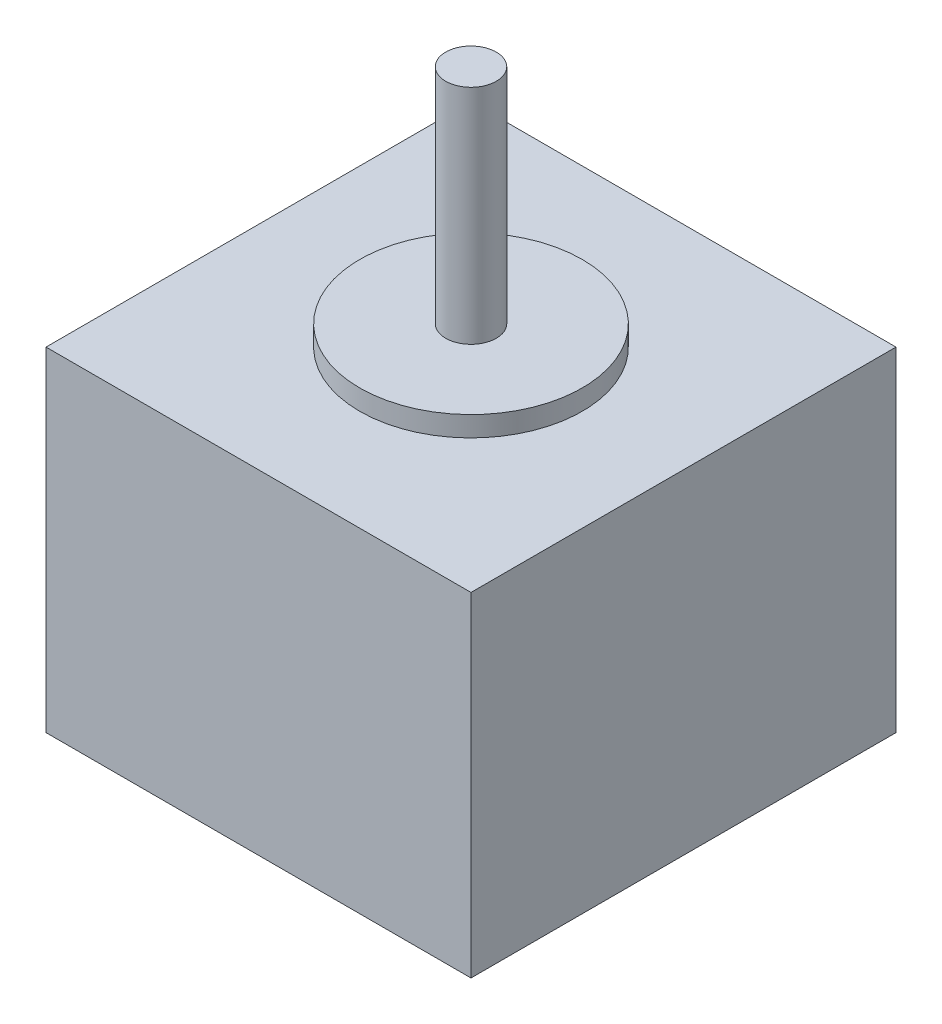
ISO-10303-21;
HEADER;
FILE_DESCRIPTION(('STEP AP214'),'2;1');
FILE_NAME('part.step','',(''),(''),'','','');
FILE_SCHEMA(('AUTOMOTIVE_DESIGN { 1 0 10303 214 1 1 1 1 }'));
ENDSEC;
DATA;
#1=APPLICATION_CONTEXT('core data for automotive mechanical design processes');
#2=APPLICATION_PROTOCOL_DEFINITION('international standard','automotive_design',2000,#1);
#3=PRODUCT_CONTEXT('',#1,'mechanical');
#4=PRODUCT('Part','Part','',(#3));
#5=PRODUCT_RELATED_PRODUCT_CATEGORY('part','',(#4));
#6=PRODUCT_DEFINITION_FORMATION('','',#4);
#7=PRODUCT_DEFINITION_CONTEXT('part definition',#1,'design');
#8=PRODUCT_DEFINITION('design','',#6,#7);
#9=PRODUCT_DEFINITION_SHAPE('','',#8);
#10=(LENGTH_UNIT() NAMED_UNIT(*) SI_UNIT(.MILLI.,.METRE.));
#11=(NAMED_UNIT(*) PLANE_ANGLE_UNIT() SI_UNIT($,.RADIAN.));
#12=(NAMED_UNIT(*) SI_UNIT($,.STERADIAN.) SOLID_ANGLE_UNIT());
#13=UNCERTAINTY_MEASURE_WITH_UNIT(LENGTH_MEASURE(1.E-05),#10,'distance_accuracy_value','');
#14=(GEOMETRIC_REPRESENTATION_CONTEXT(3) GLOBAL_UNCERTAINTY_ASSIGNED_CONTEXT((#13)) GLOBAL_UNIT_ASSIGNED_CONTEXT((#10,
#11,#12)) REPRESENTATION_CONTEXT('',''));
#15=CARTESIAN_POINT('',(0.,0.,0.));
#16=DIRECTION('',(0.,0.,1.));
#17=DIRECTION('',(1.,0.,0.));
#18=AXIS2_PLACEMENT_3D('',#15,#16,#17);
#19=CARTESIAN_POINT('',(21.,33.,21.));
#20=DIRECTION('',(-1.,0.,0.));
#21=DIRECTION('',(0.,0.,1.));
#22=AXIS2_PLACEMENT_3D('',#19,#20,#21);
#23=PLANE('',#22);
#24=DIRECTION('',(0.,0.,-1.));
#25=VECTOR('',#24,1.);
#26=CARTESIAN_POINT('',(21.,0.,21.));
#27=LINE('',#26,#25);
#28=CARTESIAN_POINT('',(21.,0.,21.));
#29=VERTEX_POINT('',#28);
#30=CARTESIAN_POINT('',(21.,0.,-21.));
#31=VERTEX_POINT('',#30);
#32=EDGE_CURVE('E115',#29,#31,#27,.T.);
#33=ORIENTED_EDGE('',*,*,#32,.T.);
#34=DIRECTION('',(0.,-1.,0.));
#35=VECTOR('',#34,1.);
#36=CARTESIAN_POINT('',(21.,33.,-21.));
#37=LINE('',#36,#35);
#38=CARTESIAN_POINT('',(21.,33.,-21.));
#39=VERTEX_POINT('',#38);
#40=EDGE_CURVE('E46',#39,#31,#37,.T.);
#41=ORIENTED_EDGE('',*,*,#40,.F.);
#42=DIRECTION('',(0.,0.,-1.));
#43=VECTOR('',#42,1.);
#44=CARTESIAN_POINT('',(21.,33.,21.));
#45=LINE('',#44,#43);
#46=CARTESIAN_POINT('',(21.,33.,21.));
#47=VERTEX_POINT('',#46);
#48=EDGE_CURVE('E98',#47,#39,#45,.T.);
#49=ORIENTED_EDGE('',*,*,#48,.F.);
#50=DIRECTION('',(0.,-1.,0.));
#51=VECTOR('',#50,1.);
#52=CARTESIAN_POINT('',(21.,33.,21.));
#53=LINE('',#52,#51);
#54=EDGE_CURVE('E111',#47,#29,#53,.T.);
#55=ORIENTED_EDGE('',*,*,#54,.T.);
#56=EDGE_LOOP('',(#33,#41,#49,#55));
#57=FACE_BOUND('',#56,.T.);
#58=ADVANCED_FACE('F43',(#57),#23,.F.);
#59=CARTESIAN_POINT('',(-21.,33.,-21.));
#60=DIRECTION('',(0.,0.,1.));
#61=DIRECTION('',(1.,0.,0.));
#62=AXIS2_PLACEMENT_3D('',#59,#60,#61);
#63=PLANE('',#62);
#64=DIRECTION('',(-1.,0.,0.));
#65=VECTOR('',#64,1.);
#66=CARTESIAN_POINT('',(-21.,0.,-21.));
#67=LINE('',#66,#65);
#68=CARTESIAN_POINT('',(-21.,0.,-21.));
#69=VERTEX_POINT('',#68);
#70=EDGE_CURVE('E104',#31,#69,#67,.T.);
#71=ORIENTED_EDGE('',*,*,#70,.T.);
#72=DIRECTION('',(0.,-1.,0.));
#73=VECTOR('',#72,1.);
#74=CARTESIAN_POINT('',(-21.,33.,-21.));
#75=LINE('',#74,#73);
#76=CARTESIAN_POINT('',(-21.,33.,-21.));
#77=VERTEX_POINT('',#76);
#78=EDGE_CURVE('E102',#77,#69,#75,.T.);
#79=ORIENTED_EDGE('',*,*,#78,.F.);
#80=DIRECTION('',(-1.,0.,0.));
#81=VECTOR('',#80,1.);
#82=CARTESIAN_POINT('',(-21.,33.,-21.));
#83=LINE('',#82,#81);
#84=EDGE_CURVE('E93',#39,#77,#83,.T.);
#85=ORIENTED_EDGE('',*,*,#84,.F.);
#86=ORIENTED_EDGE('',*,*,#40,.T.);
#87=EDGE_LOOP('',(#71,#79,#85,#86));
#88=FACE_BOUND('',#87,.T.);
#89=ADVANCED_FACE('F103',(#88),#63,.F.);
#90=CARTESIAN_POINT('',(-21.,33.,21.));
#91=DIRECTION('',(1.,0.,0.));
#92=DIRECTION('',(0.,0.,-1.));
#93=AXIS2_PLACEMENT_3D('',#90,#91,#92);
#94=PLANE('',#93);
#95=DIRECTION('',(0.,0.,1.));
#96=VECTOR('',#95,1.);
#97=CARTESIAN_POINT('',(-21.,0.,21.));
#98=LINE('',#97,#96);
#99=CARTESIAN_POINT('',(-21.,0.,21.));
#100=VERTEX_POINT('',#99);
#101=EDGE_CURVE('E79',#69,#100,#98,.T.);
#102=ORIENTED_EDGE('',*,*,#101,.T.);
#103=DIRECTION('',(0.,-1.,0.));
#104=VECTOR('',#103,1.);
#105=CARTESIAN_POINT('',(-21.,33.,21.));
#106=LINE('',#105,#104);
#107=CARTESIAN_POINT('',(-21.,33.,21.));
#108=VERTEX_POINT('',#107);
#109=EDGE_CURVE('E106',#108,#100,#106,.T.);
#110=ORIENTED_EDGE('',*,*,#109,.F.);
#111=DIRECTION('',(0.,0.,1.));
#112=VECTOR('',#111,1.);
#113=CARTESIAN_POINT('',(-21.,33.,21.));
#114=LINE('',#113,#112);
#115=EDGE_CURVE('E96',#77,#108,#114,.T.);
#116=ORIENTED_EDGE('',*,*,#115,.F.);
#117=ORIENTED_EDGE('',*,*,#78,.T.);
#118=EDGE_LOOP('',(#102,#110,#116,#117));
#119=FACE_BOUND('',#118,.T.);
#120=ADVANCED_FACE('F107',(#119),#94,.F.);
#121=CARTESIAN_POINT('',(-21.,33.,21.));
#122=DIRECTION('',(0.,0.,-1.));
#123=DIRECTION('',(-1.,0.,0.));
#124=AXIS2_PLACEMENT_3D('',#121,#122,#123);
#125=PLANE('',#124);
#126=DIRECTION('',(1.,0.,0.));
#127=VECTOR('',#126,1.);
#128=CARTESIAN_POINT('',(-21.,0.,21.));
#129=LINE('',#128,#127);
#130=EDGE_CURVE('E85',#100,#29,#129,.T.);
#131=ORIENTED_EDGE('',*,*,#130,.T.);
#132=ORIENTED_EDGE('',*,*,#54,.F.);
#133=DIRECTION('',(1.,0.,0.));
#134=VECTOR('',#133,1.);
#135=CARTESIAN_POINT('',(-21.,33.,21.));
#136=LINE('',#135,#134);
#137=EDGE_CURVE('E62',#108,#47,#136,.T.);
#138=ORIENTED_EDGE('',*,*,#137,.F.);
#139=ORIENTED_EDGE('',*,*,#109,.T.);
#140=EDGE_LOOP('',(#131,#132,#138,#139));
#141=FACE_BOUND('',#140,.T.);
#142=ADVANCED_FACE('F129',(#141),#125,.F.);
#143=CARTESIAN_POINT('',(0.,33.,0.));
#144=DIRECTION('',(0.,-1.,0.));
#145=DIRECTION('',(0.,0.,-1.));
#146=AXIS2_PLACEMENT_3D('',#143,#144,#145);
#147=PLANE('',#146);
#148=CARTESIAN_POINT('',(0.,33.,0.));
#149=DIRECTION('',(0.,1.,0.));
#150=DIRECTION('',(0.,0.,1.));
#151=AXIS2_PLACEMENT_3D('',#148,#149,#150);
#152=CIRCLE('',#151,11.);
#153=CARTESIAN_POINT('',(0.,33.,11.));
#154=VERTEX_POINT('',#153);
#155=EDGE_CURVE('E53',#154,#154,#152,.T.);
#156=ORIENTED_EDGE('',*,*,#155,.F.);
#157=EDGE_LOOP('',(#156));
#158=FACE_BOUND('',#157,.T.);
#159=ORIENTED_EDGE('',*,*,#48,.T.);
#160=ORIENTED_EDGE('',*,*,#84,.T.);
#161=ORIENTED_EDGE('',*,*,#115,.T.);
#162=ORIENTED_EDGE('',*,*,#137,.T.);
#163=EDGE_LOOP('',(#159,#160,#161,#162));
#164=FACE_BOUND('',#163,.T.);
#165=ADVANCED_FACE('F94',(#158,#164),#147,.F.);
#166=CARTESIAN_POINT('',(0.,0.,0.));
#167=DIRECTION('',(0.,-1.,0.));
#168=DIRECTION('',(0.,0.,-1.));
#169=AXIS2_PLACEMENT_3D('',#166,#167,#168);
#170=PLANE('',#169);
#171=ORIENTED_EDGE('',*,*,#32,.F.);
#172=ORIENTED_EDGE('',*,*,#130,.F.);
#173=ORIENTED_EDGE('',*,*,#101,.F.);
#174=ORIENTED_EDGE('',*,*,#70,.F.);
#175=EDGE_LOOP('',(#171,#172,#173,#174));
#176=FACE_BOUND('',#175,.T.);
#177=ADVANCED_FACE('F132',(#176),#170,.T.);
#178=CARTESIAN_POINT('',(0.,35.,0.));
#179=DIRECTION('',(0.,-1.,0.));
#180=DIRECTION('',(0.,0.,-1.));
#181=AXIS2_PLACEMENT_3D('',#178,#179,#180);
#182=CYLINDRICAL_SURFACE('',#181,11.);
#183=CARTESIAN_POINT('',(0.,35.,0.));
#184=DIRECTION('',(0.,1.,0.));
#185=DIRECTION('',(0.,0.,1.));
#186=AXIS2_PLACEMENT_3D('',#183,#184,#185);
#187=CIRCLE('',#186,11.);
#188=CARTESIAN_POINT('',(0.,35.,11.));
#189=VERTEX_POINT('',#188);
#190=EDGE_CURVE('E119',#189,#189,#187,.T.);
#191=ORIENTED_EDGE('',*,*,#190,.F.);
#192=EDGE_LOOP('',(#191));
#193=FACE_BOUND('',#192,.T.);
#194=ORIENTED_EDGE('',*,*,#155,.T.);
#195=EDGE_LOOP('',(#194));
#196=FACE_BOUND('',#195,.T.);
#197=ADVANCED_FACE('F158',(#193,#196),#182,.T.);
#198=CARTESIAN_POINT('',(0.,35.,0.));
#199=DIRECTION('',(0.,1.,0.));
#200=DIRECTION('',(0.,0.,1.));
#201=AXIS2_PLACEMENT_3D('',#198,#199,#200);
#202=PLANE('',#201);
#203=CARTESIAN_POINT('',(0.,35.,0.));
#204=DIRECTION('',(0.,1.,0.));
#205=DIRECTION('',(0.,0.,1.));
#206=AXIS2_PLACEMENT_3D('',#203,#204,#205);
#207=CIRCLE('',#206,2.5);
#208=CARTESIAN_POINT('',(0.,35.,2.5));
#209=VERTEX_POINT('',#208);
#210=EDGE_CURVE('E11',#209,#209,#207,.T.);
#211=ORIENTED_EDGE('',*,*,#210,.F.);
#212=EDGE_LOOP('',(#211));
#213=FACE_BOUND('',#212,.T.);
#214=ORIENTED_EDGE('',*,*,#190,.T.);
#215=EDGE_LOOP('',(#214));
#216=FACE_BOUND('',#215,.T.);
#217=ADVANCED_FACE('F152',(#213,#216),#202,.T.);
#218=CARTESIAN_POINT('',(0.,57.,0.));
#219=DIRECTION('',(0.,-1.,0.));
#220=DIRECTION('',(0.,0.,-1.));
#221=AXIS2_PLACEMENT_3D('',#218,#219,#220);
#222=CYLINDRICAL_SURFACE('',#221,2.5);
#223=CARTESIAN_POINT('',(0.,57.,0.));
#224=DIRECTION('',(0.,1.,0.));
#225=DIRECTION('',(0.,0.,1.));
#226=AXIS2_PLACEMENT_3D('',#223,#224,#225);
#227=CIRCLE('',#226,2.5);
#228=CARTESIAN_POINT('',(0.,57.,2.5));
#229=VERTEX_POINT('',#228);
#230=EDGE_CURVE('E141',#229,#229,#227,.T.);
#231=ORIENTED_EDGE('',*,*,#230,.F.);
#232=EDGE_LOOP('',(#231));
#233=FACE_BOUND('',#232,.T.);
#234=ORIENTED_EDGE('',*,*,#210,.T.);
#235=EDGE_LOOP('',(#234));
#236=FACE_BOUND('',#235,.T.);
#237=ADVANCED_FACE('F149',(#233,#236),#222,.T.);
#238=CARTESIAN_POINT('',(0.,57.,0.));
#239=DIRECTION('',(0.,1.,0.));
#240=DIRECTION('',(0.,0.,1.));
#241=AXIS2_PLACEMENT_3D('',#238,#239,#240);
#242=PLANE('',#241);
#243=ORIENTED_EDGE('',*,*,#230,.T.);
#244=EDGE_LOOP('',(#243));
#245=FACE_BOUND('',#244,.T.);
#246=ADVANCED_FACE('F147',(#245),#242,.T.);
#247=CLOSED_SHELL('',(#58,#89,#120,#142,#165,#177,#197,#217,#237,#246));
#248=MANIFOLD_SOLID_BREP('B2',#247);
#249=ADVANCED_BREP_SHAPE_REPRESENTATION('',(#18,#248),#14);
#250=SHAPE_DEFINITION_REPRESENTATION(#9,#249);
ENDSEC;
END-ISO-10303-21;
